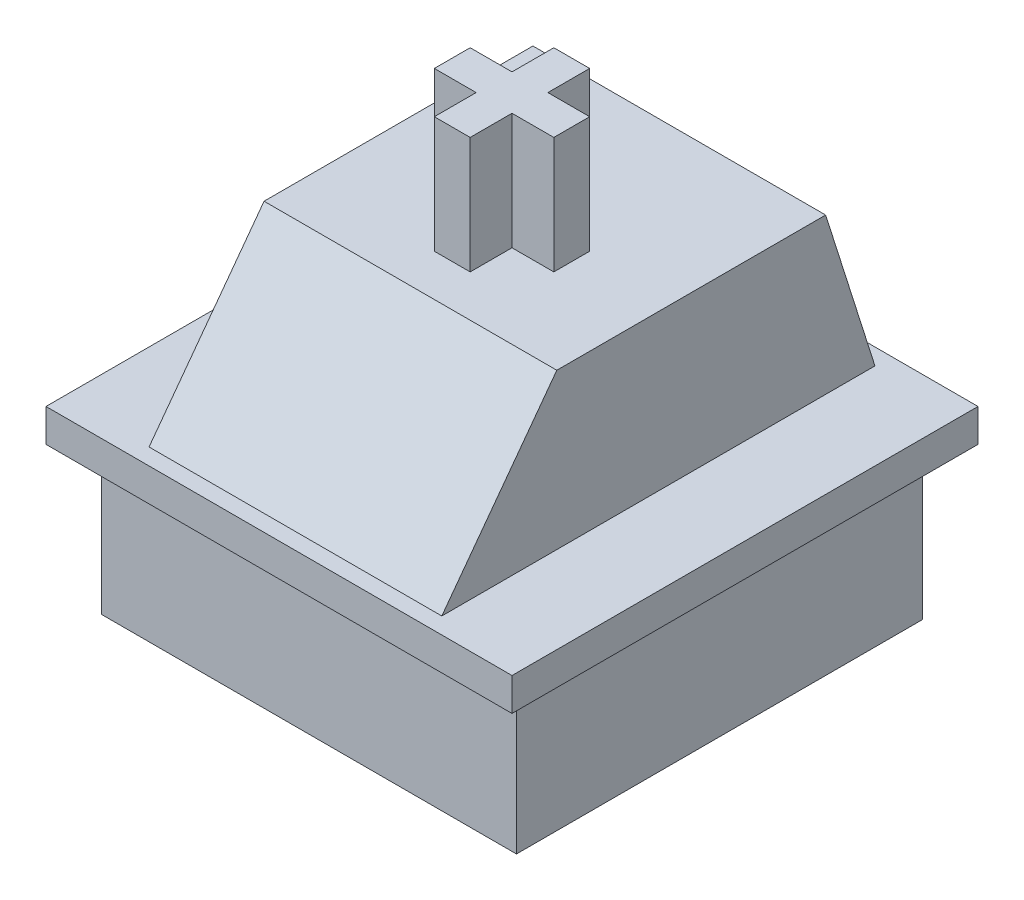
ISO-10303-21;
HEADER;
FILE_DESCRIPTION(('STEP AP214'),'2;1');
FILE_NAME('part.step','',(''),(''),'','','');
FILE_SCHEMA(('AUTOMOTIVE_DESIGN { 1 0 10303 214 1 1 1 1 }'));
ENDSEC;
DATA;
#1=APPLICATION_CONTEXT('core data for automotive mechanical design processes');
#2=APPLICATION_PROTOCOL_DEFINITION('international standard','automotive_design',2000,#1);
#3=PRODUCT_CONTEXT('',#1,'mechanical');
#4=PRODUCT('Part','Part','',(#3));
#5=PRODUCT_RELATED_PRODUCT_CATEGORY('part','',(#4));
#6=PRODUCT_DEFINITION_FORMATION('','',#4);
#7=PRODUCT_DEFINITION_CONTEXT('part definition',#1,'design');
#8=PRODUCT_DEFINITION('design','',#6,#7);
#9=PRODUCT_DEFINITION_SHAPE('','',#8);
#10=(LENGTH_UNIT() NAMED_UNIT(*) SI_UNIT(.MILLI.,.METRE.));
#11=(NAMED_UNIT(*) PLANE_ANGLE_UNIT() SI_UNIT($,.RADIAN.));
#12=(NAMED_UNIT(*) SI_UNIT($,.STERADIAN.) SOLID_ANGLE_UNIT());
#13=UNCERTAINTY_MEASURE_WITH_UNIT(LENGTH_MEASURE(1.E-05),#10,'distance_accuracy_value','');
#14=(GEOMETRIC_REPRESENTATION_CONTEXT(3) GLOBAL_UNCERTAINTY_ASSIGNED_CONTEXT((#13)) GLOBAL_UNIT_ASSIGNED_CONTEXT((#10,
#11,#12)) REPRESENTATION_CONTEXT('',''));
#15=CARTESIAN_POINT('',(0.,0.,0.));
#16=DIRECTION('',(0.,0.,1.));
#17=DIRECTION('',(1.,0.,0.));
#18=AXIS2_PLACEMENT_3D('',#15,#16,#17);
#19=CARTESIAN_POINT('',(0.,-5.,0.));
#20=DIRECTION('',(0.,1.,0.));
#21=DIRECTION('',(0.,0.,1.));
#22=AXIS2_PLACEMENT_3D('',#19,#20,#21);
#23=PLANE('',#22);
#24=DIRECTION('',(0.,0.,1.));
#25=VECTOR('',#24,1.);
#26=CARTESIAN_POINT('',(3.04,-5.,-4.86));
#27=LINE('',#26,#25);
#28=CARTESIAN_POINT('',(3.04,-5.,-5.16));
#29=VERTEX_POINT('',#28);
#30=CARTESIAN_POINT('',(3.04,-5.,-4.86));
#31=VERTEX_POINT('',#30);
#32=EDGE_CURVE('E275',#29,#31,#27,.T.);
#33=ORIENTED_EDGE('',*,*,#32,.F.);
#34=DIRECTION('',(1.,0.,0.));
#35=VECTOR('',#34,1.);
#36=CARTESIAN_POINT('',(2.04,-5.,-5.16));
#37=LINE('',#36,#35);
#38=CARTESIAN_POINT('',(2.04,-5.,-5.16));
#39=VERTEX_POINT('',#38);
#40=EDGE_CURVE('E308',#39,#29,#37,.T.);
#41=ORIENTED_EDGE('',*,*,#40,.F.);
#42=DIRECTION('',(0.,0.,-1.));
#43=VECTOR('',#42,1.);
#44=CARTESIAN_POINT('',(2.04,-5.,-4.86));
#45=LINE('',#44,#43);
#46=CARTESIAN_POINT('',(2.04,-5.,-4.86));
#47=VERTEX_POINT('',#46);
#48=EDGE_CURVE('E320',#47,#39,#45,.T.);
#49=ORIENTED_EDGE('',*,*,#48,.F.);
#50=DIRECTION('',(-1.,0.,0.));
#51=VECTOR('',#50,1.);
#52=CARTESIAN_POINT('',(2.04,-5.,-4.86));
#53=LINE('',#52,#51);
#54=EDGE_CURVE('E317',#31,#47,#53,.T.);
#55=ORIENTED_EDGE('',*,*,#54,.F.);
#56=EDGE_LOOP('',(#33,#41,#49,#55));
#57=FACE_BOUND('',#56,.T.);
#58=CARTESIAN_POINT('',(0.,-5.,0.));
#59=DIRECTION('',(0.,-1.,0.));
#60=DIRECTION('',(0.,0.,-1.));
#61=AXIS2_PLACEMENT_3D('',#58,#59,#60);
#62=CIRCLE('',#61,1.95);
#63=CARTESIAN_POINT('',(0.,-5.,-1.95));
#64=VERTEX_POINT('',#63);
#65=EDGE_CURVE('E12',#64,#64,#62,.T.);
#66=ORIENTED_EDGE('',*,*,#65,.F.);
#67=EDGE_LOOP('',(#66));
#68=FACE_BOUND('',#67,.T.);
#69=DIRECTION('',(0.,0.,1.));
#70=VECTOR('',#69,1.);
#71=CARTESIAN_POINT('',(6.95,-5.,-6.8));
#72=LINE('',#71,#70);
#73=CARTESIAN_POINT('',(6.95,-5.,-6.8));
#74=VERTEX_POINT('',#73);
#75=CARTESIAN_POINT('',(6.95,-5.,6.8));
#76=VERTEX_POINT('',#75);
#77=EDGE_CURVE('E420',#74,#76,#72,.T.);
#78=ORIENTED_EDGE('',*,*,#77,.T.);
#79=DIRECTION('',(-1.,0.,0.));
#80=VECTOR('',#79,1.);
#81=CARTESIAN_POINT('',(-6.95,-5.,6.8));
#82=LINE('',#81,#80);
#83=CARTESIAN_POINT('',(-6.95,-5.,6.8));
#84=VERTEX_POINT('',#83);
#85=EDGE_CURVE('E423',#76,#84,#82,.T.);
#86=ORIENTED_EDGE('',*,*,#85,.T.);
#87=DIRECTION('',(0.,0.,-1.));
#88=VECTOR('',#87,1.);
#89=CARTESIAN_POINT('',(-6.95,-5.,-6.8));
#90=LINE('',#89,#88);
#91=CARTESIAN_POINT('',(-6.95,-5.,-6.8));
#92=VERTEX_POINT('',#91);
#93=EDGE_CURVE('E426',#84,#92,#90,.T.);
#94=ORIENTED_EDGE('',*,*,#93,.T.);
#95=DIRECTION('',(1.,0.,0.));
#96=VECTOR('',#95,1.);
#97=CARTESIAN_POINT('',(-6.95,-5.,-6.8));
#98=LINE('',#97,#96);
#99=EDGE_CURVE('E428',#92,#74,#98,.T.);
#100=ORIENTED_EDGE('',*,*,#99,.T.);
#101=EDGE_LOOP('',(#78,#86,#94,#100));
#102=FACE_BOUND('',#101,.T.);
#103=DIRECTION('',(0.,0.,1.));
#104=VECTOR('',#103,1.);
#105=CARTESIAN_POINT('',(-3.31,-5.,-2.39));
#106=LINE('',#105,#104);
#107=CARTESIAN_POINT('',(-3.31,-5.,-2.69));
#108=VERTEX_POINT('',#107);
#109=CARTESIAN_POINT('',(-3.31,-5.,-2.39));
#110=VERTEX_POINT('',#109);
#111=EDGE_CURVE('E269',#108,#110,#106,.T.);
#112=ORIENTED_EDGE('',*,*,#111,.F.);
#113=DIRECTION('',(1.,0.,0.));
#114=VECTOR('',#113,1.);
#115=CARTESIAN_POINT('',(-4.31,-5.,-2.69));
#116=LINE('',#115,#114);
#117=CARTESIAN_POINT('',(-4.31,-5.,-2.69));
#118=VERTEX_POINT('',#117);
#119=EDGE_CURVE('E271',#118,#108,#116,.T.);
#120=ORIENTED_EDGE('',*,*,#119,.F.);
#121=DIRECTION('',(0.,0.,-1.));
#122=VECTOR('',#121,1.);
#123=CARTESIAN_POINT('',(-4.31,-5.,-2.39));
#124=LINE('',#123,#122);
#125=CARTESIAN_POINT('',(-4.31,-5.,-2.39));
#126=VERTEX_POINT('',#125);
#127=EDGE_CURVE('E84',#126,#118,#124,.T.);
#128=ORIENTED_EDGE('',*,*,#127,.F.);
#129=DIRECTION('',(-1.,0.,0.));
#130=VECTOR('',#129,1.);
#131=CARTESIAN_POINT('',(-4.31,-5.,-2.39));
#132=LINE('',#131,#130);
#133=EDGE_CURVE('E79',#110,#126,#132,.T.);
#134=ORIENTED_EDGE('',*,*,#133,.F.);
#135=EDGE_LOOP('',(#112,#120,#128,#134));
#136=FACE_BOUND('',#135,.T.);
#137=ADVANCED_FACE('F63',(#57,#68,#102,#136),#23,.F.);
#138=CARTESIAN_POINT('',(7.8,1.1,7.8));
#139=DIRECTION('',(-1.,0.,0.));
#140=DIRECTION('',(0.,0.,1.));
#141=AXIS2_PLACEMENT_3D('',#138,#139,#140);
#142=PLANE('',#141);
#143=DIRECTION('',(0.,0.,-1.));
#144=VECTOR('',#143,1.);
#145=CARTESIAN_POINT('',(7.8,0.,7.8));
#146=LINE('',#145,#144);
#147=CARTESIAN_POINT('',(7.8,0.,7.8));
#148=VERTEX_POINT('',#147);
#149=CARTESIAN_POINT('',(7.8,0.,-7.8));
#150=VERTEX_POINT('',#149);
#151=EDGE_CURVE('E485',#148,#150,#146,.T.);
#152=ORIENTED_EDGE('',*,*,#151,.T.);
#153=DIRECTION('',(0.,-1.,0.));
#154=VECTOR('',#153,1.);
#155=CARTESIAN_POINT('',(7.8,1.1,-7.8));
#156=LINE('',#155,#154);
#157=CARTESIAN_POINT('',(7.8,1.1,-7.8));
#158=VERTEX_POINT('',#157);
#159=EDGE_CURVE('E67',#158,#150,#156,.T.);
#160=ORIENTED_EDGE('',*,*,#159,.F.);
#161=DIRECTION('',(0.,0.,-1.));
#162=VECTOR('',#161,1.);
#163=CARTESIAN_POINT('',(7.8,1.1,7.8));
#164=LINE('',#163,#162);
#165=CARTESIAN_POINT('',(7.8,1.1,7.8));
#166=VERTEX_POINT('',#165);
#167=EDGE_CURVE('E486',#166,#158,#164,.T.);
#168=ORIENTED_EDGE('',*,*,#167,.F.);
#169=DIRECTION('',(0.,-1.,0.));
#170=VECTOR('',#169,1.);
#171=CARTESIAN_POINT('',(7.8,1.1,7.8));
#172=LINE('',#171,#170);
#173=EDGE_CURVE('E496',#166,#148,#172,.T.);
#174=ORIENTED_EDGE('',*,*,#173,.T.);
#175=EDGE_LOOP('',(#152,#160,#168,#174));
#176=FACE_BOUND('',#175,.T.);
#177=ADVANCED_FACE('F65',(#176),#142,.F.);
#178=CARTESIAN_POINT('',(-7.8,1.1,-7.8));
#179=DIRECTION('',(0.,0.,1.));
#180=DIRECTION('',(1.,0.,0.));
#181=AXIS2_PLACEMENT_3D('',#178,#179,#180);
#182=PLANE('',#181);
#183=DIRECTION('',(-1.,0.,0.));
#184=VECTOR('',#183,1.);
#185=CARTESIAN_POINT('',(-7.8,0.,-7.8));
#186=LINE('',#185,#184);
#187=CARTESIAN_POINT('',(-7.8,0.,-7.8));
#188=VERTEX_POINT('',#187);
#189=EDGE_CURVE('E499',#150,#188,#186,.T.);
#190=ORIENTED_EDGE('',*,*,#189,.T.);
#191=DIRECTION('',(0.,-1.,0.));
#192=VECTOR('',#191,1.);
#193=CARTESIAN_POINT('',(-7.8,1.1,-7.8));
#194=LINE('',#193,#192);
#195=CARTESIAN_POINT('',(-7.8,1.1,-7.8));
#196=VERTEX_POINT('',#195);
#197=EDGE_CURVE('E508',#196,#188,#194,.T.);
#198=ORIENTED_EDGE('',*,*,#197,.F.);
#199=DIRECTION('',(-1.,0.,0.));
#200=VECTOR('',#199,1.);
#201=CARTESIAN_POINT('',(-7.8,1.1,-7.8));
#202=LINE('',#201,#200);
#203=EDGE_CURVE('E489',#158,#196,#202,.T.);
#204=ORIENTED_EDGE('',*,*,#203,.F.);
#205=ORIENTED_EDGE('',*,*,#159,.T.);
#206=EDGE_LOOP('',(#190,#198,#204,#205));
#207=FACE_BOUND('',#206,.T.);
#208=ADVANCED_FACE('F517',(#207),#182,.F.);
#209=CARTESIAN_POINT('',(-7.8,1.1,7.8));
#210=DIRECTION('',(1.,0.,0.));
#211=DIRECTION('',(0.,0.,-1.));
#212=AXIS2_PLACEMENT_3D('',#209,#210,#211);
#213=PLANE('',#212);
#214=DIRECTION('',(0.,0.,1.));
#215=VECTOR('',#214,1.);
#216=CARTESIAN_POINT('',(-7.8,0.,7.8));
#217=LINE('',#216,#215);
#218=CARTESIAN_POINT('',(-7.8,0.,7.8));
#219=VERTEX_POINT('',#218);
#220=EDGE_CURVE('E501',#188,#219,#217,.T.);
#221=ORIENTED_EDGE('',*,*,#220,.T.);
#222=DIRECTION('',(0.,-1.,0.));
#223=VECTOR('',#222,1.);
#224=CARTESIAN_POINT('',(-7.8,1.1,7.8));
#225=LINE('',#224,#223);
#226=CARTESIAN_POINT('',(-7.8,1.1,7.8));
#227=VERTEX_POINT('',#226);
#228=EDGE_CURVE('E506',#227,#219,#225,.T.);
#229=ORIENTED_EDGE('',*,*,#228,.F.);
#230=DIRECTION('',(0.,0.,1.));
#231=VECTOR('',#230,1.);
#232=CARTESIAN_POINT('',(-7.8,1.1,7.8));
#233=LINE('',#232,#231);
#234=EDGE_CURVE('E492',#196,#227,#233,.T.);
#235=ORIENTED_EDGE('',*,*,#234,.F.);
#236=ORIENTED_EDGE('',*,*,#197,.T.);
#237=EDGE_LOOP('',(#221,#229,#235,#236));
#238=FACE_BOUND('',#237,.T.);
#239=ADVANCED_FACE('F526',(#238),#213,.F.);
#240=CARTESIAN_POINT('',(-7.8,1.1,7.8));
#241=DIRECTION('',(0.,0.,-1.));
#242=DIRECTION('',(-1.,0.,0.));
#243=AXIS2_PLACEMENT_3D('',#240,#241,#242);
#244=PLANE('',#243);
#245=DIRECTION('',(1.,0.,0.));
#246=VECTOR('',#245,1.);
#247=CARTESIAN_POINT('',(-7.8,0.,7.8));
#248=LINE('',#247,#246);
#249=EDGE_CURVE('E490',#219,#148,#248,.T.);
#250=ORIENTED_EDGE('',*,*,#249,.T.);
#251=ORIENTED_EDGE('',*,*,#173,.F.);
#252=DIRECTION('',(1.,0.,0.));
#253=VECTOR('',#252,1.);
#254=CARTESIAN_POINT('',(-7.8,1.1,7.8));
#255=LINE('',#254,#253);
#256=EDGE_CURVE('E494',#227,#166,#255,.T.);
#257=ORIENTED_EDGE('',*,*,#256,.F.);
#258=ORIENTED_EDGE('',*,*,#228,.T.);
#259=EDGE_LOOP('',(#250,#251,#257,#258));
#260=FACE_BOUND('',#259,.T.);
#261=ADVANCED_FACE('F529',(#260),#244,.F.);
#262=CARTESIAN_POINT('',(0.,1.1,0.));
#263=DIRECTION('',(0.,-1.,0.));
#264=DIRECTION('',(0.,0.,-1.));
#265=AXIS2_PLACEMENT_3D('',#262,#263,#264);
#266=PLANE('',#265);
#267=DIRECTION('',(-1.,0.,0.));
#268=VECTOR('',#267,1.);
#269=CARTESIAN_POINT('',(4.9,1.1,7.25));
#270=LINE('',#269,#268);
#271=CARTESIAN_POINT('',(4.9,1.1,7.25));
#272=VERTEX_POINT('',#271);
#273=CARTESIAN_POINT('',(-4.9,1.1,7.25));
#274=VERTEX_POINT('',#273);
#275=EDGE_CURVE('E465',#272,#274,#270,.T.);
#276=ORIENTED_EDGE('',*,*,#275,.T.);
#277=DIRECTION('',(0.,0.,-1.));
#278=VECTOR('',#277,1.);
#279=CARTESIAN_POINT('',(-4.9,1.1,0.));
#280=LINE('',#279,#278);
#281=CARTESIAN_POINT('',(-4.9,1.1,-7.25));
#282=VERTEX_POINT('',#281);
#283=EDGE_CURVE('E452',#274,#282,#280,.T.);
#284=ORIENTED_EDGE('',*,*,#283,.T.);
#285=DIRECTION('',(-1.,0.,0.));
#286=VECTOR('',#285,1.);
#287=CARTESIAN_POINT('',(4.9,1.1,-7.25));
#288=LINE('',#287,#286);
#289=CARTESIAN_POINT('',(4.9,1.1,-7.25));
#290=VERTEX_POINT('',#289);
#291=EDGE_CURVE('E482',#290,#282,#288,.T.);
#292=ORIENTED_EDGE('',*,*,#291,.F.);
#293=DIRECTION('',(0.,0.,-1.));
#294=VECTOR('',#293,1.);
#295=CARTESIAN_POINT('',(4.9,1.1,0.));
#296=LINE('',#295,#294);
#297=EDGE_CURVE('E453',#272,#290,#296,.T.);
#298=ORIENTED_EDGE('',*,*,#297,.F.);
#299=EDGE_LOOP('',(#276,#284,#292,#298));
#300=FACE_BOUND('',#299,.T.);
#301=ORIENTED_EDGE('',*,*,#167,.T.);
#302=ORIENTED_EDGE('',*,*,#203,.T.);
#303=ORIENTED_EDGE('',*,*,#234,.T.);
#304=ORIENTED_EDGE('',*,*,#256,.T.);
#305=EDGE_LOOP('',(#301,#302,#303,#304));
#306=FACE_BOUND('',#305,.T.);
#307=ADVANCED_FACE('F531',(#300,#306),#266,.F.);
#308=CARTESIAN_POINT('',(0.,0.,0.));
#309=DIRECTION('',(0.,-1.,0.));
#310=DIRECTION('',(0.,0.,-1.));
#311=AXIS2_PLACEMENT_3D('',#308,#309,#310);
#312=PLANE('',#311);
#313=DIRECTION('',(0.,0.,1.));
#314=VECTOR('',#313,1.);
#315=CARTESIAN_POINT('',(6.95,0.,-6.8));
#316=LINE('',#315,#314);
#317=CARTESIAN_POINT('',(6.95,0.,-6.8));
#318=VERTEX_POINT('',#317);
#319=CARTESIAN_POINT('',(6.95,0.,6.8));
#320=VERTEX_POINT('',#319);
#321=EDGE_CURVE('E418',#318,#320,#316,.T.);
#322=ORIENTED_EDGE('',*,*,#321,.F.);
#323=DIRECTION('',(1.,0.,0.));
#324=VECTOR('',#323,1.);
#325=CARTESIAN_POINT('',(-6.95,0.,-6.8));
#326=LINE('',#325,#324);
#327=CARTESIAN_POINT('',(-6.95,0.,-6.8));
#328=VERTEX_POINT('',#327);
#329=EDGE_CURVE('E424',#328,#318,#326,.T.);
#330=ORIENTED_EDGE('',*,*,#329,.F.);
#331=DIRECTION('',(0.,0.,-1.));
#332=VECTOR('',#331,1.);
#333=CARTESIAN_POINT('',(-6.95,0.,-6.8));
#334=LINE('',#333,#332);
#335=CARTESIAN_POINT('',(-6.95,0.,6.8));
#336=VERTEX_POINT('',#335);
#337=EDGE_CURVE('E436',#336,#328,#334,.T.);
#338=ORIENTED_EDGE('',*,*,#337,.F.);
#339=DIRECTION('',(-1.,0.,0.));
#340=VECTOR('',#339,1.);
#341=CARTESIAN_POINT('',(-6.95,0.,6.8));
#342=LINE('',#341,#340);
#343=EDGE_CURVE('E433',#320,#336,#342,.T.);
#344=ORIENTED_EDGE('',*,*,#343,.F.);
#345=EDGE_LOOP('',(#322,#330,#338,#344));
#346=FACE_BOUND('',#345,.T.);
#347=ORIENTED_EDGE('',*,*,#151,.F.);
#348=ORIENTED_EDGE('',*,*,#249,.F.);
#349=ORIENTED_EDGE('',*,*,#220,.F.);
#350=ORIENTED_EDGE('',*,*,#189,.F.);
#351=EDGE_LOOP('',(#347,#348,#349,#350));
#352=FACE_BOUND('',#351,.T.);
#353=ADVANCED_FACE('F524',(#346,#352),#312,.T.);
#354=CARTESIAN_POINT('',(4.9,2.19066778664427,-6.90392272154557));
#355=DIRECTION('',(0.,-0.302446971412494,0.953166212936343));
#356=DIRECTION('',(0.,-0.953166212936343,-0.302446971412494));
#357=AXIS2_PLACEMENT_3D('',#354,#355,#356);
#358=PLANE('',#357);
#359=DIRECTION('',(0.,0.953166212936343,0.302446971412494));
#360=VECTOR('',#359,1.);
#361=CARTESIAN_POINT('',(-4.9,2.19066778664427,-6.90392272154557));
#362=LINE('',#361,#360);
#363=CARTESIAN_POINT('',(-4.9,6.3,-5.6));
#364=VERTEX_POINT('',#363);
#365=EDGE_CURVE('E468',#282,#364,#362,.T.);
#366=ORIENTED_EDGE('',*,*,#365,.T.);
#367=DIRECTION('',(-1.,0.,0.));
#368=VECTOR('',#367,1.);
#369=CARTESIAN_POINT('',(4.9,6.3,-5.6));
#370=LINE('',#369,#368);
#371=CARTESIAN_POINT('',(4.9,6.3,-5.6));
#372=VERTEX_POINT('',#371);
#373=EDGE_CURVE('E480',#372,#364,#370,.T.);
#374=ORIENTED_EDGE('',*,*,#373,.F.);
#375=DIRECTION('',(0.,0.953166212936343,0.302446971412494));
#376=VECTOR('',#375,1.);
#377=CARTESIAN_POINT('',(4.9,2.19066778664427,-6.90392272154557));
#378=LINE('',#377,#376);
#379=EDGE_CURVE('E456',#290,#372,#378,.T.);
#380=ORIENTED_EDGE('',*,*,#379,.F.);
#381=ORIENTED_EDGE('',*,*,#291,.T.);
#382=EDGE_LOOP('',(#366,#374,#380,#381));
#383=FACE_BOUND('',#382,.T.);
#384=ADVANCED_FACE('F539',(#383),#358,.F.);
#385=CARTESIAN_POINT('',(4.9,6.3,0.));
#386=DIRECTION('',(0.,1.,0.));
#387=DIRECTION('',(0.,0.,1.));
#388=AXIS2_PLACEMENT_3D('',#385,#386,#387);
#389=PLANE('',#388);
#390=DIRECTION('',(0.,0.,-1.));
#391=VECTOR('',#390,1.);
#392=CARTESIAN_POINT('',(0.6,6.3,2.));
#393=LINE('',#392,#391);
#394=CARTESIAN_POINT('',(0.6,6.3,-0.6));
#395=VERTEX_POINT('',#394);
#396=CARTESIAN_POINT('',(0.6,6.3,-2.));
#397=VERTEX_POINT('',#396);
#398=EDGE_CURVE('E358',#395,#397,#393,.T.);
#399=ORIENTED_EDGE('',*,*,#398,.F.);
#400=DIRECTION('',(1.,0.,0.));
#401=VECTOR('',#400,1.);
#402=CARTESIAN_POINT('',(-2.,6.3,-0.6));
#403=LINE('',#402,#401);
#404=CARTESIAN_POINT('',(2.,6.3,-0.6));
#405=VERTEX_POINT('',#404);
#406=EDGE_CURVE('E391',#395,#405,#403,.T.);
#407=ORIENTED_EDGE('',*,*,#406,.T.);
#408=DIRECTION('',(0.,0.,-1.));
#409=VECTOR('',#408,1.);
#410=CARTESIAN_POINT('',(2.,6.3,0.6));
#411=LINE('',#410,#409);
#412=CARTESIAN_POINT('',(2.,6.3,0.6));
#413=VERTEX_POINT('',#412);
#414=EDGE_CURVE('E395',#413,#405,#411,.T.);
#415=ORIENTED_EDGE('',*,*,#414,.F.);
#416=DIRECTION('',(1.,0.,0.));
#417=VECTOR('',#416,1.);
#418=CARTESIAN_POINT('',(-2.,6.3,0.6));
#419=LINE('',#418,#417);
#420=CARTESIAN_POINT('',(0.6,6.3,0.6));
#421=VERTEX_POINT('',#420);
#422=EDGE_CURVE('E398',#421,#413,#419,.T.);
#423=ORIENTED_EDGE('',*,*,#422,.F.);
#424=CARTESIAN_POINT('',(0.6,6.3,2.));
#425=VERTEX_POINT('',#424);
#426=EDGE_CURVE('E359',#425,#421,#393,.T.);
#427=ORIENTED_EDGE('',*,*,#426,.F.);
#428=DIRECTION('',(1.,0.,0.));
#429=VECTOR('',#428,1.);
#430=CARTESIAN_POINT('',(-0.6,6.3,2.));
#431=LINE('',#430,#429);
#432=CARTESIAN_POINT('',(-0.6,6.3,2.));
#433=VERTEX_POINT('',#432);
#434=EDGE_CURVE('E362',#433,#425,#431,.T.);
#435=ORIENTED_EDGE('',*,*,#434,.F.);
#436=DIRECTION('',(0.,0.,-1.));
#437=VECTOR('',#436,1.);
#438=CARTESIAN_POINT('',(-0.6,6.3,2.));
#439=LINE('',#438,#437);
#440=CARTESIAN_POINT('',(-0.6,6.3,0.6));
#441=VERTEX_POINT('',#440);
#442=EDGE_CURVE('E351',#433,#441,#439,.T.);
#443=ORIENTED_EDGE('',*,*,#442,.T.);
#444=CARTESIAN_POINT('',(-2.,6.3,0.6));
#445=VERTEX_POINT('',#444);
#446=EDGE_CURVE('E377',#445,#441,#419,.T.);
#447=ORIENTED_EDGE('',*,*,#446,.F.);
#448=DIRECTION('',(0.,0.,-1.));
#449=VECTOR('',#448,1.);
#450=CARTESIAN_POINT('',(-2.,6.3,0.6));
#451=LINE('',#450,#449);
#452=CARTESIAN_POINT('',(-2.,6.3,-0.6));
#453=VERTEX_POINT('',#452);
#454=EDGE_CURVE('E336',#445,#453,#451,.T.);
#455=ORIENTED_EDGE('',*,*,#454,.T.);
#456=CARTESIAN_POINT('',(-0.6,6.3,-0.6));
#457=VERTEX_POINT('',#456);
#458=EDGE_CURVE('E392',#453,#457,#403,.T.);
#459=ORIENTED_EDGE('',*,*,#458,.T.);
#460=CARTESIAN_POINT('',(-0.6,6.3,-2.));
#461=VERTEX_POINT('',#460);
#462=EDGE_CURVE('E355',#457,#461,#439,.T.);
#463=ORIENTED_EDGE('',*,*,#462,.T.);
#464=DIRECTION('',(1.,0.,0.));
#465=VECTOR('',#464,1.);
#466=CARTESIAN_POINT('',(-0.6,6.3,-2.));
#467=LINE('',#466,#465);
#468=EDGE_CURVE('E354',#461,#397,#467,.T.);
#469=ORIENTED_EDGE('',*,*,#468,.T.);
#470=EDGE_LOOP('',(#399,#407,#415,#423,#427,#435,#443,#447,#455,#459,#463,#469));
#471=FACE_BOUND('',#470,.T.);
#472=DIRECTION('',(0.,0.,-1.));
#473=VECTOR('',#472,1.);
#474=CARTESIAN_POINT('',(-4.9,6.3,0.));
#475=LINE('',#474,#473);
#476=CARTESIAN_POINT('',(-4.9,6.3,3.4));
#477=VERTEX_POINT('',#476);
#478=EDGE_CURVE('E471',#477,#364,#475,.T.);
#479=ORIENTED_EDGE('',*,*,#478,.F.);
#480=DIRECTION('',(-1.,0.,0.));
#481=VECTOR('',#480,1.);
#482=CARTESIAN_POINT('',(4.9,6.3,3.4));
#483=LINE('',#482,#481);
#484=CARTESIAN_POINT('',(4.9,6.3,3.4));
#485=VERTEX_POINT('',#484);
#486=EDGE_CURVE('E478',#485,#477,#483,.T.);
#487=ORIENTED_EDGE('',*,*,#486,.F.);
#488=DIRECTION('',(0.,0.,-1.));
#489=VECTOR('',#488,1.);
#490=CARTESIAN_POINT('',(4.9,6.3,0.));
#491=LINE('',#490,#489);
#492=EDGE_CURVE('E459',#485,#372,#491,.T.);
#493=ORIENTED_EDGE('',*,*,#492,.T.);
#494=ORIENTED_EDGE('',*,*,#373,.T.);
#495=EDGE_LOOP('',(#479,#487,#493,#494));
#496=FACE_BOUND('',#495,.T.);
#497=ADVANCED_FACE('F582',(#471,#496),#389,.T.);
#498=CARTESIAN_POINT('',(4.9,3.85666766198865,5.20900567333532));
#499=DIRECTION('',(0.,0.595042724126078,0.803694068949508));
#500=DIRECTION('',(0.,-0.803694068949508,0.595042724126078));
#501=AXIS2_PLACEMENT_3D('',#498,#499,#500);
#502=PLANE('',#501);
#503=DIRECTION('',(0.,0.803694068949508,-0.595042724126078));
#504=VECTOR('',#503,1.);
#505=CARTESIAN_POINT('',(-4.9,3.85666766198865,5.20900567333532));
#506=LINE('',#505,#504);
#507=EDGE_CURVE('E457',#274,#477,#506,.T.);
#508=ORIENTED_EDGE('',*,*,#507,.F.);
#509=ORIENTED_EDGE('',*,*,#275,.F.);
#510=DIRECTION('',(0.,0.803694068949508,-0.595042724126078));
#511=VECTOR('',#510,1.);
#512=CARTESIAN_POINT('',(4.9,3.85666766198865,5.20900567333532));
#513=LINE('',#512,#511);
#514=EDGE_CURVE('E462',#272,#485,#513,.T.);
#515=ORIENTED_EDGE('',*,*,#514,.T.);
#516=ORIENTED_EDGE('',*,*,#486,.T.);
#517=EDGE_LOOP('',(#508,#509,#515,#516));
#518=FACE_BOUND('',#517,.T.);
#519=ADVANCED_FACE('F575',(#518),#502,.T.);
#520=CARTESIAN_POINT('',(4.9,0.,0.));
#521=DIRECTION('',(1.,0.,0.));
#522=DIRECTION('',(0.,0.,-1.));
#523=AXIS2_PLACEMENT_3D('',#520,#521,#522);
#524=PLANE('',#523);
#525=ORIENTED_EDGE('',*,*,#297,.T.);
#526=ORIENTED_EDGE('',*,*,#379,.T.);
#527=ORIENTED_EDGE('',*,*,#492,.F.);
#528=ORIENTED_EDGE('',*,*,#514,.F.);
#529=EDGE_LOOP('',(#525,#526,#527,#528));
#530=FACE_BOUND('',#529,.T.);
#531=ADVANCED_FACE('F572',(#530),#524,.T.);
#532=CARTESIAN_POINT('',(-4.9,0.,0.));
#533=DIRECTION('',(1.,0.,0.));
#534=DIRECTION('',(0.,0.,-1.));
#535=AXIS2_PLACEMENT_3D('',#532,#533,#534);
#536=PLANE('',#535);
#537=ORIENTED_EDGE('',*,*,#283,.F.);
#538=ORIENTED_EDGE('',*,*,#507,.T.);
#539=ORIENTED_EDGE('',*,*,#478,.T.);
#540=ORIENTED_EDGE('',*,*,#365,.F.);
#541=EDGE_LOOP('',(#537,#538,#539,#540));
#542=FACE_BOUND('',#541,.T.);
#543=ADVANCED_FACE('F570',(#542),#536,.F.);
#544=CARTESIAN_POINT('',(6.95,-5.,-6.8));
#545=DIRECTION('',(-1.,0.,0.));
#546=DIRECTION('',(0.,0.,1.));
#547=AXIS2_PLACEMENT_3D('',#544,#545,#546);
#548=PLANE('',#547);
#549=ORIENTED_EDGE('',*,*,#321,.T.);
#550=DIRECTION('',(0.,1.,0.));
#551=VECTOR('',#550,1.);
#552=CARTESIAN_POINT('',(6.95,-5.,6.8));
#553=LINE('',#552,#551);
#554=EDGE_CURVE('E449',#76,#320,#553,.T.);
#555=ORIENTED_EDGE('',*,*,#554,.F.);
#556=ORIENTED_EDGE('',*,*,#77,.F.);
#557=DIRECTION('',(0.,1.,0.));
#558=VECTOR('',#557,1.);
#559=CARTESIAN_POINT('',(6.95,-5.,-6.8));
#560=LINE('',#559,#558);
#561=EDGE_CURVE('E430',#74,#318,#560,.T.);
#562=ORIENTED_EDGE('',*,*,#561,.T.);
#563=EDGE_LOOP('',(#549,#555,#556,#562));
#564=FACE_BOUND('',#563,.T.);
#565=ADVANCED_FACE('F566',(#564),#548,.F.);
#566=CARTESIAN_POINT('',(-6.95,-5.,6.8));
#567=DIRECTION('',(0.,0.,-1.));
#568=DIRECTION('',(-1.,0.,0.));
#569=AXIS2_PLACEMENT_3D('',#566,#567,#568);
#570=PLANE('',#569);
#571=ORIENTED_EDGE('',*,*,#343,.T.);
#572=DIRECTION('',(0.,1.,0.));
#573=VECTOR('',#572,1.);
#574=CARTESIAN_POINT('',(-6.95,-5.,6.8));
#575=LINE('',#574,#573);
#576=EDGE_CURVE('E446',#84,#336,#575,.T.);
#577=ORIENTED_EDGE('',*,*,#576,.F.);
#578=ORIENTED_EDGE('',*,*,#85,.F.);
#579=ORIENTED_EDGE('',*,*,#554,.T.);
#580=EDGE_LOOP('',(#571,#577,#578,#579));
#581=FACE_BOUND('',#580,.T.);
#582=ADVANCED_FACE('F562',(#581),#570,.F.);
#583=CARTESIAN_POINT('',(-6.95,-5.,-6.8));
#584=DIRECTION('',(1.,0.,0.));
#585=DIRECTION('',(0.,0.,-1.));
#586=AXIS2_PLACEMENT_3D('',#583,#584,#585);
#587=PLANE('',#586);
#588=ORIENTED_EDGE('',*,*,#337,.T.);
#589=DIRECTION('',(0.,1.,0.));
#590=VECTOR('',#589,1.);
#591=CARTESIAN_POINT('',(-6.95,-5.,-6.8));
#592=LINE('',#591,#590);
#593=EDGE_CURVE('E443',#92,#328,#592,.T.);
#594=ORIENTED_EDGE('',*,*,#593,.F.);
#595=ORIENTED_EDGE('',*,*,#93,.F.);
#596=ORIENTED_EDGE('',*,*,#576,.T.);
#597=EDGE_LOOP('',(#588,#594,#595,#596));
#598=FACE_BOUND('',#597,.T.);
#599=ADVANCED_FACE('F558',(#598),#587,.F.);
#600=CARTESIAN_POINT('',(-6.95,-5.,-6.8));
#601=DIRECTION('',(0.,0.,1.));
#602=DIRECTION('',(1.,0.,0.));
#603=AXIS2_PLACEMENT_3D('',#600,#601,#602);
#604=PLANE('',#603);
#605=ORIENTED_EDGE('',*,*,#329,.T.);
#606=ORIENTED_EDGE('',*,*,#561,.F.);
#607=ORIENTED_EDGE('',*,*,#99,.F.);
#608=ORIENTED_EDGE('',*,*,#593,.T.);
#609=EDGE_LOOP('',(#605,#606,#607,#608));
#610=FACE_BOUND('',#609,.T.);
#611=ADVANCED_FACE('F555',(#610),#604,.F.);
#612=CARTESIAN_POINT('',(0.,-8.3,0.));
#613=DIRECTION('',(0.,1.,0.));
#614=DIRECTION('',(0.,0.,1.));
#615=AXIS2_PLACEMENT_3D('',#612,#613,#614);
#616=CYLINDRICAL_SURFACE('',#615,1.95);
#617=CARTESIAN_POINT('',(0.,-8.3,0.));
#618=DIRECTION('',(0.,-1.,0.));
#619=DIRECTION('',(0.,0.,-1.));
#620=AXIS2_PLACEMENT_3D('',#617,#618,#619);
#621=CIRCLE('',#620,1.95);
#622=CARTESIAN_POINT('',(0.,-8.3,-1.95));
#623=VERTEX_POINT('',#622);
#624=EDGE_CURVE('E416',#623,#623,#621,.T.);
#625=ORIENTED_EDGE('',*,*,#624,.F.);
#626=EDGE_LOOP('',(#625));
#627=FACE_BOUND('',#626,.T.);
#628=ORIENTED_EDGE('',*,*,#65,.T.);
#629=EDGE_LOOP('',(#628));
#630=FACE_BOUND('',#629,.T.);
#631=ADVANCED_FACE('F553',(#627,#630),#616,.T.);
#632=CARTESIAN_POINT('',(0.,-8.3,0.));
#633=DIRECTION('',(0.,-1.,0.));
#634=DIRECTION('',(0.,0.,-1.));
#635=AXIS2_PLACEMENT_3D('',#632,#633,#634);
#636=PLANE('',#635);
#637=ORIENTED_EDGE('',*,*,#624,.T.);
#638=EDGE_LOOP('',(#637));
#639=FACE_BOUND('',#638,.T.);
#640=ADVANCED_FACE('F640',(#639),#636,.T.);
#641=CARTESIAN_POINT('',(0.6,10.2,2.));
#642=DIRECTION('',(-1.,0.,0.));
#643=DIRECTION('',(0.,0.,1.));
#644=AXIS2_PLACEMENT_3D('',#641,#642,#643);
#645=PLANE('',#644);
#646=DIRECTION('',(0.,0.,-1.));
#647=VECTOR('',#646,1.);
#648=CARTESIAN_POINT('',(0.6,10.2,2.));
#649=LINE('',#648,#647);
#650=CARTESIAN_POINT('',(0.6,10.2,-0.6));
#651=VERTEX_POINT('',#650);
#652=CARTESIAN_POINT('',(0.6,10.2,-2.));
#653=VERTEX_POINT('',#652);
#654=EDGE_CURVE('E344',#651,#653,#649,.T.);
#655=ORIENTED_EDGE('',*,*,#654,.F.);
#656=DIRECTION('',(0.,-1.,0.));
#657=VECTOR('',#656,1.);
#658=CARTESIAN_POINT('',(0.6,10.2,-0.6));
#659=LINE('',#658,#657);
#660=EDGE_CURVE('E366',#651,#395,#659,.T.);
#661=ORIENTED_EDGE('',*,*,#660,.T.);
#662=ORIENTED_EDGE('',*,*,#398,.T.);
#663=DIRECTION('',(0.,-1.,0.));
#664=VECTOR('',#663,1.);
#665=CARTESIAN_POINT('',(0.6,10.2,-2.));
#666=LINE('',#665,#664);
#667=EDGE_CURVE('E370',#653,#397,#666,.T.);
#668=ORIENTED_EDGE('',*,*,#667,.F.);
#669=EDGE_LOOP('',(#655,#661,#662,#668));
#670=FACE_BOUND('',#669,.T.);
#671=ADVANCED_FACE('F646',(#670),#645,.F.);
#672=CARTESIAN_POINT('',(-0.6,10.2,-2.));
#673=DIRECTION('',(0.,0.,-1.));
#674=DIRECTION('',(-1.,0.,0.));
#675=AXIS2_PLACEMENT_3D('',#672,#673,#674);
#676=PLANE('',#675);
#677=ORIENTED_EDGE('',*,*,#468,.F.);
#678=DIRECTION('',(0.,-1.,0.));
#679=VECTOR('',#678,1.);
#680=CARTESIAN_POINT('',(-0.6,10.2,-2.));
#681=LINE('',#680,#679);
#682=CARTESIAN_POINT('',(-0.6,10.2,-2.));
#683=VERTEX_POINT('',#682);
#684=EDGE_CURVE('E350',#683,#461,#681,.T.);
#685=ORIENTED_EDGE('',*,*,#684,.F.);
#686=DIRECTION('',(1.,0.,0.));
#687=VECTOR('',#686,1.);
#688=CARTESIAN_POINT('',(-0.6,10.2,-2.));
#689=LINE('',#688,#687);
#690=EDGE_CURVE('E340',#683,#653,#689,.T.);
#691=ORIENTED_EDGE('',*,*,#690,.T.);
#692=ORIENTED_EDGE('',*,*,#667,.T.);
#693=EDGE_LOOP('',(#677,#685,#691,#692));
#694=FACE_BOUND('',#693,.T.);
#695=ADVANCED_FACE('F652',(#694),#676,.T.);
#696=CARTESIAN_POINT('',(-0.6,10.2,2.));
#697=DIRECTION('',(-1.,0.,0.));
#698=DIRECTION('',(0.,0.,1.));
#699=AXIS2_PLACEMENT_3D('',#696,#697,#698);
#700=PLANE('',#699);
#701=DIRECTION('',(0.,-1.,0.));
#702=VECTOR('',#701,1.);
#703=CARTESIAN_POINT('',(-0.6,10.2,-0.6));
#704=LINE('',#703,#702);
#705=CARTESIAN_POINT('',(-0.6,10.2,-0.6));
#706=VERTEX_POINT('',#705);
#707=EDGE_CURVE('E411',#706,#457,#704,.T.);
#708=ORIENTED_EDGE('',*,*,#707,.F.);
#709=DIRECTION('',(0.,0.,-1.));
#710=VECTOR('',#709,1.);
#711=CARTESIAN_POINT('',(-0.6,10.2,2.));
#712=LINE('',#711,#710);
#713=EDGE_CURVE('E341',#706,#683,#712,.T.);
#714=ORIENTED_EDGE('',*,*,#713,.T.);
#715=ORIENTED_EDGE('',*,*,#684,.T.);
#716=ORIENTED_EDGE('',*,*,#462,.F.);
#717=EDGE_LOOP('',(#708,#714,#715,#716));
#718=FACE_BOUND('',#717,.T.);
#719=ADVANCED_FACE('F661',(#718),#700,.T.);
#720=CARTESIAN_POINT('',(0.,10.2,0.));
#721=DIRECTION('',(0.,-1.,0.));
#722=DIRECTION('',(0.,0.,-1.));
#723=AXIS2_PLACEMENT_3D('',#720,#721,#722);
#724=PLANE('',#723);
#725=ORIENTED_EDGE('',*,*,#713,.F.);
#726=DIRECTION('',(1.,0.,0.));
#727=VECTOR('',#726,1.);
#728=CARTESIAN_POINT('',(-2.,10.2,-0.6));
#729=LINE('',#728,#727);
#730=CARTESIAN_POINT('',(-2.,10.2,-0.6));
#731=VERTEX_POINT('',#730);
#732=EDGE_CURVE('E378',#731,#706,#729,.T.);
#733=ORIENTED_EDGE('',*,*,#732,.F.);
#734=DIRECTION('',(0.,0.,-1.));
#735=VECTOR('',#734,1.);
#736=CARTESIAN_POINT('',(-2.,10.2,0.6));
#737=LINE('',#736,#735);
#738=CARTESIAN_POINT('',(-2.,10.2,0.6));
#739=VERTEX_POINT('',#738);
#740=EDGE_CURVE('E373',#739,#731,#737,.T.);
#741=ORIENTED_EDGE('',*,*,#740,.F.);
#742=DIRECTION('',(1.,0.,0.));
#743=VECTOR('',#742,1.);
#744=CARTESIAN_POINT('',(-2.,10.2,0.6));
#745=LINE('',#744,#743);
#746=CARTESIAN_POINT('',(-0.6,10.2,0.6));
#747=VERTEX_POINT('',#746);
#748=EDGE_CURVE('E385',#739,#747,#745,.T.);
#749=ORIENTED_EDGE('',*,*,#748,.T.);
#750=CARTESIAN_POINT('',(-0.6,10.2,2.));
#751=VERTEX_POINT('',#750);
#752=EDGE_CURVE('E337',#751,#747,#712,.T.);
#753=ORIENTED_EDGE('',*,*,#752,.F.);
#754=DIRECTION('',(1.,0.,0.));
#755=VECTOR('',#754,1.);
#756=CARTESIAN_POINT('',(-0.6,10.2,2.));
#757=LINE('',#756,#755);
#758=CARTESIAN_POINT('',(0.6,10.2,2.));
#759=VERTEX_POINT('',#758);
#760=EDGE_CURVE('E348',#751,#759,#757,.T.);
#761=ORIENTED_EDGE('',*,*,#760,.T.);
#762=CARTESIAN_POINT('',(0.6,10.2,0.6));
#763=VERTEX_POINT('',#762);
#764=EDGE_CURVE('E345',#759,#763,#649,.T.);
#765=ORIENTED_EDGE('',*,*,#764,.T.);
#766=CARTESIAN_POINT('',(2.,10.2,0.6));
#767=VERTEX_POINT('',#766);
#768=EDGE_CURVE('E384',#763,#767,#745,.T.);
#769=ORIENTED_EDGE('',*,*,#768,.T.);
#770=DIRECTION('',(0.,0.,-1.));
#771=VECTOR('',#770,1.);
#772=CARTESIAN_POINT('',(2.,10.2,0.6));
#773=LINE('',#772,#771);
#774=CARTESIAN_POINT('',(2.,10.2,-0.6));
#775=VERTEX_POINT('',#774);
#776=EDGE_CURVE('E381',#767,#775,#773,.T.);
#777=ORIENTED_EDGE('',*,*,#776,.T.);
#778=EDGE_CURVE('E376',#651,#775,#729,.T.);
#779=ORIENTED_EDGE('',*,*,#778,.F.);
#780=ORIENTED_EDGE('',*,*,#654,.T.);
#781=ORIENTED_EDGE('',*,*,#690,.F.);
#782=EDGE_LOOP('',(#725,#733,#741,#749,#753,#761,#765,#769,#777,#779,#780,#781));
#783=FACE_BOUND('',#782,.T.);
#784=ADVANCED_FACE('F669',(#783),#724,.F.);
#785=CARTESIAN_POINT('',(-0.6,10.2,2.));
#786=DIRECTION('',(0.,0.,-1.));
#787=DIRECTION('',(-1.,0.,0.));
#788=AXIS2_PLACEMENT_3D('',#785,#786,#787);
#789=PLANE('',#788);
#790=ORIENTED_EDGE('',*,*,#434,.T.);
#791=DIRECTION('',(0.,-1.,0.));
#792=VECTOR('',#791,1.);
#793=CARTESIAN_POINT('',(0.6,10.2,2.));
#794=LINE('',#793,#792);
#795=EDGE_CURVE('E367',#759,#425,#794,.T.);
#796=ORIENTED_EDGE('',*,*,#795,.F.);
#797=ORIENTED_EDGE('',*,*,#760,.F.);
#798=DIRECTION('',(0.,-1.,0.));
#799=VECTOR('',#798,1.);
#800=CARTESIAN_POINT('',(-0.6,10.2,2.));
#801=LINE('',#800,#799);
#802=EDGE_CURVE('E364',#751,#433,#801,.T.);
#803=ORIENTED_EDGE('',*,*,#802,.T.);
#804=EDGE_LOOP('',(#790,#796,#797,#803));
#805=FACE_BOUND('',#804,.T.);
#806=ADVANCED_FACE('F678',(#805),#789,.F.);
#807=DIRECTION('',(0.,-1.,0.));
#808=VECTOR('',#807,1.);
#809=CARTESIAN_POINT('',(0.6,10.2,0.6));
#810=LINE('',#809,#808);
#811=EDGE_CURVE('E410',#763,#421,#810,.T.);
#812=ORIENTED_EDGE('',*,*,#811,.F.);
#813=ORIENTED_EDGE('',*,*,#764,.F.);
#814=ORIENTED_EDGE('',*,*,#795,.T.);
#815=ORIENTED_EDGE('',*,*,#426,.T.);
#816=EDGE_LOOP('',(#812,#813,#814,#815));
#817=FACE_BOUND('',#816,.T.);
#818=ADVANCED_FACE('F655',(#817),#645,.F.);
#819=ORIENTED_EDGE('',*,*,#752,.T.);
#820=DIRECTION('',(0.,-1.,0.));
#821=VECTOR('',#820,1.);
#822=CARTESIAN_POINT('',(-0.6,10.2,0.6));
#823=LINE('',#822,#821);
#824=EDGE_CURVE('E413',#747,#441,#823,.T.);
#825=ORIENTED_EDGE('',*,*,#824,.T.);
#826=ORIENTED_EDGE('',*,*,#442,.F.);
#827=ORIENTED_EDGE('',*,*,#802,.F.);
#828=EDGE_LOOP('',(#819,#825,#826,#827));
#829=FACE_BOUND('',#828,.T.);
#830=ADVANCED_FACE('F672',(#829),#700,.T.);
#831=CARTESIAN_POINT('',(-2.,10.2,0.6));
#832=DIRECTION('',(0.,0.,-1.));
#833=DIRECTION('',(-1.,0.,0.));
#834=AXIS2_PLACEMENT_3D('',#831,#832,#833);
#835=PLANE('',#834);
#836=ORIENTED_EDGE('',*,*,#768,.F.);
#837=ORIENTED_EDGE('',*,*,#811,.T.);
#838=ORIENTED_EDGE('',*,*,#422,.T.);
#839=DIRECTION('',(0.,-1.,0.));
#840=VECTOR('',#839,1.);
#841=CARTESIAN_POINT('',(2.,10.2,0.6));
#842=LINE('',#841,#840);
#843=EDGE_CURVE('E403',#767,#413,#842,.T.);
#844=ORIENTED_EDGE('',*,*,#843,.F.);
#845=EDGE_LOOP('',(#836,#837,#838,#844));
#846=FACE_BOUND('',#845,.T.);
#847=ADVANCED_FACE('F699',(#846),#835,.F.);
#848=CARTESIAN_POINT('',(2.,10.2,0.6));
#849=DIRECTION('',(-1.,0.,0.));
#850=DIRECTION('',(0.,0.,1.));
#851=AXIS2_PLACEMENT_3D('',#848,#849,#850);
#852=PLANE('',#851);
#853=ORIENTED_EDGE('',*,*,#414,.T.);
#854=DIRECTION('',(0.,-1.,0.));
#855=VECTOR('',#854,1.);
#856=CARTESIAN_POINT('',(2.,10.2,-0.6));
#857=LINE('',#856,#855);
#858=EDGE_CURVE('E406',#775,#405,#857,.T.);
#859=ORIENTED_EDGE('',*,*,#858,.F.);
#860=ORIENTED_EDGE('',*,*,#776,.F.);
#861=ORIENTED_EDGE('',*,*,#843,.T.);
#862=EDGE_LOOP('',(#853,#859,#860,#861));
#863=FACE_BOUND('',#862,.T.);
#864=ADVANCED_FACE('F706',(#863),#852,.F.);
#865=CARTESIAN_POINT('',(-2.,10.2,-0.6));
#866=DIRECTION('',(0.,0.,-1.));
#867=DIRECTION('',(-1.,0.,0.));
#868=AXIS2_PLACEMENT_3D('',#865,#866,#867);
#869=PLANE('',#868);
#870=ORIENTED_EDGE('',*,*,#660,.F.);
#871=ORIENTED_EDGE('',*,*,#778,.T.);
#872=ORIENTED_EDGE('',*,*,#858,.T.);
#873=ORIENTED_EDGE('',*,*,#406,.F.);
#874=EDGE_LOOP('',(#870,#871,#872,#873));
#875=FACE_BOUND('',#874,.T.);
#876=ADVANCED_FACE('F715',(#875),#869,.T.);
#877=CARTESIAN_POINT('',(-2.,10.2,0.6));
#878=DIRECTION('',(-1.,0.,0.));
#879=DIRECTION('',(0.,0.,1.));
#880=AXIS2_PLACEMENT_3D('',#877,#878,#879);
#881=PLANE('',#880);
#882=ORIENTED_EDGE('',*,*,#454,.F.);
#883=DIRECTION('',(0.,-1.,0.));
#884=VECTOR('',#883,1.);
#885=CARTESIAN_POINT('',(-2.,10.2,0.6));
#886=LINE('',#885,#884);
#887=EDGE_CURVE('E401',#739,#445,#886,.T.);
#888=ORIENTED_EDGE('',*,*,#887,.F.);
#889=ORIENTED_EDGE('',*,*,#740,.T.);
#890=DIRECTION('',(0.,-1.,0.));
#891=VECTOR('',#890,1.);
#892=CARTESIAN_POINT('',(-2.,10.2,-0.6));
#893=LINE('',#892,#891);
#894=EDGE_CURVE('E388',#731,#453,#893,.T.);
#895=ORIENTED_EDGE('',*,*,#894,.T.);
#896=EDGE_LOOP('',(#882,#888,#889,#895));
#897=FACE_BOUND('',#896,.T.);
#898=ADVANCED_FACE('F723',(#897),#881,.T.);
#899=ORIENTED_EDGE('',*,*,#824,.F.);
#900=ORIENTED_EDGE('',*,*,#748,.F.);
#901=ORIENTED_EDGE('',*,*,#887,.T.);
#902=ORIENTED_EDGE('',*,*,#446,.T.);
#903=EDGE_LOOP('',(#899,#900,#901,#902));
#904=FACE_BOUND('',#903,.T.);
#905=ADVANCED_FACE('F709',(#904),#835,.F.);
#906=ORIENTED_EDGE('',*,*,#732,.T.);
#907=ORIENTED_EDGE('',*,*,#707,.T.);
#908=ORIENTED_EDGE('',*,*,#458,.F.);
#909=ORIENTED_EDGE('',*,*,#894,.F.);
#910=EDGE_LOOP('',(#906,#907,#908,#909));
#911=FACE_BOUND('',#910,.T.);
#912=ADVANCED_FACE('F726',(#911),#869,.T.);
#913=CARTESIAN_POINT('',(3.04,-8.8,-4.86));
#914=DIRECTION('',(-1.,0.,0.));
#915=DIRECTION('',(0.,0.,1.));
#916=AXIS2_PLACEMENT_3D('',#913,#914,#915);
#917=PLANE('',#916);
#918=ORIENTED_EDGE('',*,*,#32,.T.);
#919=DIRECTION('',(0.,1.,0.));
#920=VECTOR('',#919,1.);
#921=CARTESIAN_POINT('',(3.04,-8.8,-4.86));
#922=LINE('',#921,#920);
#923=CARTESIAN_POINT('',(3.04,-8.8,-4.86));
#924=VERTEX_POINT('',#923);
#925=EDGE_CURVE('E333',#924,#31,#922,.T.);
#926=ORIENTED_EDGE('',*,*,#925,.F.);
#927=DIRECTION('',(0.,0.,1.));
#928=VECTOR('',#927,1.);
#929=CARTESIAN_POINT('',(3.04,-8.8,-4.86));
#930=LINE('',#929,#928);
#931=CARTESIAN_POINT('',(3.04,-8.8,-5.16));
#932=VERTEX_POINT('',#931);
#933=EDGE_CURVE('E304',#932,#924,#930,.T.);
#934=ORIENTED_EDGE('',*,*,#933,.F.);
#935=DIRECTION('',(0.,1.,0.));
#936=VECTOR('',#935,1.);
#937=CARTESIAN_POINT('',(3.04,-8.8,-5.16));
#938=LINE('',#937,#936);
#939=EDGE_CURVE('E314',#932,#29,#938,.T.);
#940=ORIENTED_EDGE('',*,*,#939,.T.);
#941=EDGE_LOOP('',(#918,#926,#934,#940));
#942=FACE_BOUND('',#941,.T.);
#943=ADVANCED_FACE('F745',(#942),#917,.F.);
#944=CARTESIAN_POINT('',(2.04,-8.8,-4.86));
#945=DIRECTION('',(0.,0.,-1.));
#946=DIRECTION('',(-1.,0.,0.));
#947=AXIS2_PLACEMENT_3D('',#944,#945,#946);
#948=PLANE('',#947);
#949=ORIENTED_EDGE('',*,*,#54,.T.);
#950=DIRECTION('',(0.,1.,0.));
#951=VECTOR('',#950,1.);
#952=CARTESIAN_POINT('',(2.04,-8.8,-4.86));
#953=LINE('',#952,#951);
#954=CARTESIAN_POINT('',(2.04,-8.8,-4.86));
#955=VERTEX_POINT('',#954);
#956=EDGE_CURVE('E330',#955,#47,#953,.T.);
#957=ORIENTED_EDGE('',*,*,#956,.F.);
#958=DIRECTION('',(-1.,0.,0.));
#959=VECTOR('',#958,1.);
#960=CARTESIAN_POINT('',(2.04,-8.8,-4.86));
#961=LINE('',#960,#959);
#962=EDGE_CURVE('E307',#924,#955,#961,.T.);
#963=ORIENTED_EDGE('',*,*,#962,.F.);
#964=ORIENTED_EDGE('',*,*,#925,.T.);
#965=EDGE_LOOP('',(#949,#957,#963,#964));
#966=FACE_BOUND('',#965,.T.);
#967=ADVANCED_FACE('F752',(#966),#948,.F.);
#968=CARTESIAN_POINT('',(2.04,-8.8,-4.86));
#969=DIRECTION('',(1.,0.,0.));
#970=DIRECTION('',(0.,0.,-1.));
#971=AXIS2_PLACEMENT_3D('',#968,#969,#970);
#972=PLANE('',#971);
#973=ORIENTED_EDGE('',*,*,#48,.T.);
#974=DIRECTION('',(0.,1.,0.));
#975=VECTOR('',#974,1.);
#976=CARTESIAN_POINT('',(2.04,-8.8,-5.16));
#977=LINE('',#976,#975);
#978=CARTESIAN_POINT('',(2.04,-8.8,-5.16));
#979=VERTEX_POINT('',#978);
#980=EDGE_CURVE('E327',#979,#39,#977,.T.);
#981=ORIENTED_EDGE('',*,*,#980,.F.);
#982=DIRECTION('',(0.,0.,-1.));
#983=VECTOR('',#982,1.);
#984=CARTESIAN_POINT('',(2.04,-8.8,-4.86));
#985=LINE('',#984,#983);
#986=EDGE_CURVE('E310',#955,#979,#985,.T.);
#987=ORIENTED_EDGE('',*,*,#986,.F.);
#988=ORIENTED_EDGE('',*,*,#956,.T.);
#989=EDGE_LOOP('',(#973,#981,#987,#988));
#990=FACE_BOUND('',#989,.T.);
#991=ADVANCED_FACE('F760',(#990),#972,.F.);
#992=CARTESIAN_POINT('',(2.04,-8.8,-5.16));
#993=DIRECTION('',(0.,0.,1.));
#994=DIRECTION('',(1.,0.,0.));
#995=AXIS2_PLACEMENT_3D('',#992,#993,#994);
#996=PLANE('',#995);
#997=ORIENTED_EDGE('',*,*,#40,.T.);
#998=ORIENTED_EDGE('',*,*,#939,.F.);
#999=DIRECTION('',(1.,0.,0.));
#1000=VECTOR('',#999,1.);
#1001=CARTESIAN_POINT('',(2.04,-8.8,-5.16));
#1002=LINE('',#1001,#1000);
#1003=EDGE_CURVE('E312',#979,#932,#1002,.T.);
#1004=ORIENTED_EDGE('',*,*,#1003,.F.);
#1005=ORIENTED_EDGE('',*,*,#980,.T.);
#1006=EDGE_LOOP('',(#997,#998,#1004,#1005));
#1007=FACE_BOUND('',#1006,.T.);
#1008=ADVANCED_FACE('F768',(#1007),#996,.F.);
#1009=CARTESIAN_POINT('',(0.,-8.8,0.));
#1010=DIRECTION('',(0.,-1.,0.));
#1011=DIRECTION('',(0.,0.,-1.));
#1012=AXIS2_PLACEMENT_3D('',#1009,#1010,#1011);
#1013=PLANE('',#1012);
#1014=ORIENTED_EDGE('',*,*,#933,.T.);
#1015=ORIENTED_EDGE('',*,*,#962,.T.);
#1016=ORIENTED_EDGE('',*,*,#986,.T.);
#1017=ORIENTED_EDGE('',*,*,#1003,.T.);
#1018=EDGE_LOOP('',(#1014,#1015,#1016,#1017));
#1019=FACE_BOUND('',#1018,.T.);
#1020=ADVANCED_FACE('F776',(#1019),#1013,.T.);
#1021=CARTESIAN_POINT('',(-3.31,-8.8,-2.39));
#1022=DIRECTION('',(-1.,0.,0.));
#1023=DIRECTION('',(0.,0.,1.));
#1024=AXIS2_PLACEMENT_3D('',#1021,#1022,#1023);
#1025=PLANE('',#1024);
#1026=ORIENTED_EDGE('',*,*,#111,.T.);
#1027=DIRECTION('',(0.,1.,0.));
#1028=VECTOR('',#1027,1.);
#1029=CARTESIAN_POINT('',(-3.31,-8.8,-2.39));
#1030=LINE('',#1029,#1028);
#1031=CARTESIAN_POINT('',(-3.31,-8.8,-2.39));
#1032=VERTEX_POINT('',#1031);
#1033=EDGE_CURVE('E1016',#1032,#110,#1030,.T.);
#1034=ORIENTED_EDGE('',*,*,#1033,.F.);
#1035=DIRECTION('',(0.,0.,1.));
#1036=VECTOR('',#1035,1.);
#1037=CARTESIAN_POINT('',(-3.31,-8.8,-2.39));
#1038=LINE('',#1037,#1036);
#1039=CARTESIAN_POINT('',(-3.31,-8.8,-2.69));
#1040=VERTEX_POINT('',#1039);
#1041=EDGE_CURVE('E286',#1040,#1032,#1038,.T.);
#1042=ORIENTED_EDGE('',*,*,#1041,.F.);
#1043=DIRECTION('',(0.,1.,0.));
#1044=VECTOR('',#1043,1.);
#1045=CARTESIAN_POINT('',(-3.31,-8.8,-2.69));
#1046=LINE('',#1045,#1044);
#1047=EDGE_CURVE('E282',#1040,#108,#1046,.T.);
#1048=ORIENTED_EDGE('',*,*,#1047,.T.);
#1049=EDGE_LOOP('',(#1026,#1034,#1042,#1048));
#1050=FACE_BOUND('',#1049,.T.);
#1051=ADVANCED_FACE('F288',(#1050),#1025,.F.);
#1052=CARTESIAN_POINT('',(-4.31,-8.8,-2.39));
#1053=DIRECTION('',(0.,0.,-1.));
#1054=DIRECTION('',(-1.,0.,0.));
#1055=AXIS2_PLACEMENT_3D('',#1052,#1053,#1054);
#1056=PLANE('',#1055);
#1057=ORIENTED_EDGE('',*,*,#133,.T.);
#1058=DIRECTION('',(0.,1.,0.));
#1059=VECTOR('',#1058,1.);
#1060=CARTESIAN_POINT('',(-4.31,-8.8,-2.39));
#1061=LINE('',#1060,#1059);
#1062=CARTESIAN_POINT('',(-4.31,-8.8,-2.39));
#1063=VERTEX_POINT('',#1062);
#1064=EDGE_CURVE('E294',#1063,#126,#1061,.T.);
#1065=ORIENTED_EDGE('',*,*,#1064,.F.);
#1066=DIRECTION('',(-1.,0.,0.));
#1067=VECTOR('',#1066,1.);
#1068=CARTESIAN_POINT('',(-4.31,-8.8,-2.39));
#1069=LINE('',#1068,#1067);
#1070=EDGE_CURVE('E301',#1032,#1063,#1069,.T.);
#1071=ORIENTED_EDGE('',*,*,#1070,.F.);
#1072=ORIENTED_EDGE('',*,*,#1033,.T.);
#1073=EDGE_LOOP('',(#1057,#1065,#1071,#1072));
#1074=FACE_BOUND('',#1073,.T.);
#1075=ADVANCED_FACE('F791',(#1074),#1056,.F.);
#1076=CARTESIAN_POINT('',(-4.31,-8.8,-2.39));
#1077=DIRECTION('',(1.,0.,0.));
#1078=DIRECTION('',(0.,0.,-1.));
#1079=AXIS2_PLACEMENT_3D('',#1076,#1077,#1078);
#1080=PLANE('',#1079);
#1081=ORIENTED_EDGE('',*,*,#127,.T.);
#1082=DIRECTION('',(0.,1.,0.));
#1083=VECTOR('',#1082,1.);
#1084=CARTESIAN_POINT('',(-4.31,-8.8,-2.69));
#1085=LINE('',#1084,#1083);
#1086=CARTESIAN_POINT('',(-4.31,-8.8,-2.69));
#1087=VERTEX_POINT('',#1086);
#1088=EDGE_CURVE('E285',#1087,#118,#1085,.T.);
#1089=ORIENTED_EDGE('',*,*,#1088,.F.);
#1090=DIRECTION('',(0.,0.,-1.));
#1091=VECTOR('',#1090,1.);
#1092=CARTESIAN_POINT('',(-4.31,-8.8,-2.39));
#1093=LINE('',#1092,#1091);
#1094=EDGE_CURVE('E292',#1063,#1087,#1093,.T.);
#1095=ORIENTED_EDGE('',*,*,#1094,.F.);
#1096=ORIENTED_EDGE('',*,*,#1064,.T.);
#1097=EDGE_LOOP('',(#1081,#1089,#1095,#1096));
#1098=FACE_BOUND('',#1097,.T.);
#1099=ADVANCED_FACE('F798',(#1098),#1080,.F.);
#1100=CARTESIAN_POINT('',(-4.31,-8.8,-2.69));
#1101=DIRECTION('',(0.,0.,1.));
#1102=DIRECTION('',(1.,0.,0.));
#1103=AXIS2_PLACEMENT_3D('',#1100,#1101,#1102);
#1104=PLANE('',#1103);
#1105=ORIENTED_EDGE('',*,*,#119,.T.);
#1106=ORIENTED_EDGE('',*,*,#1047,.F.);
#1107=DIRECTION('',(1.,0.,0.));
#1108=VECTOR('',#1107,1.);
#1109=CARTESIAN_POINT('',(-4.31,-8.8,-2.69));
#1110=LINE('',#1109,#1108);
#1111=EDGE_CURVE('E290',#1087,#1040,#1110,.T.);
#1112=ORIENTED_EDGE('',*,*,#1111,.F.);
#1113=ORIENTED_EDGE('',*,*,#1088,.T.);
#1114=EDGE_LOOP('',(#1105,#1106,#1112,#1113));
#1115=FACE_BOUND('',#1114,.T.);
#1116=ADVANCED_FACE('F280',(#1115),#1104,.F.);
#1117=CARTESIAN_POINT('',(0.,-8.8,0.));
#1118=DIRECTION('',(0.,-1.,0.));
#1119=DIRECTION('',(0.,0.,-1.));
#1120=AXIS2_PLACEMENT_3D('',#1117,#1118,#1119);
#1121=PLANE('',#1120);
#1122=ORIENTED_EDGE('',*,*,#1041,.T.);
#1123=ORIENTED_EDGE('',*,*,#1070,.T.);
#1124=ORIENTED_EDGE('',*,*,#1094,.T.);
#1125=ORIENTED_EDGE('',*,*,#1111,.T.);
#1126=EDGE_LOOP('',(#1122,#1123,#1124,#1125));
#1127=FACE_BOUND('',#1126,.T.);
#1128=ADVANCED_FACE('F813',(#1127),#1121,.T.);
#1129=CLOSED_SHELL('',(#137,#177,#208,#239,#261,#307,#353,#384,#497,#519,#531,#543,#565,#582,
#599,#611,#631,#640,#671,#695,#719,#784,#806,#818,#830,#847,#864,#876,#898,#905,#912,#943,#967,
#991,#1008,#1020,#1051,#1075,#1099,#1116,#1128));
#1130=MANIFOLD_SOLID_BREP('B2',#1129);
#1131=ADVANCED_BREP_SHAPE_REPRESENTATION('',(#18,#1130),#14);
#1132=SHAPE_DEFINITION_REPRESENTATION(#9,#1131);
ENDSEC;
END-ISO-10303-21;
